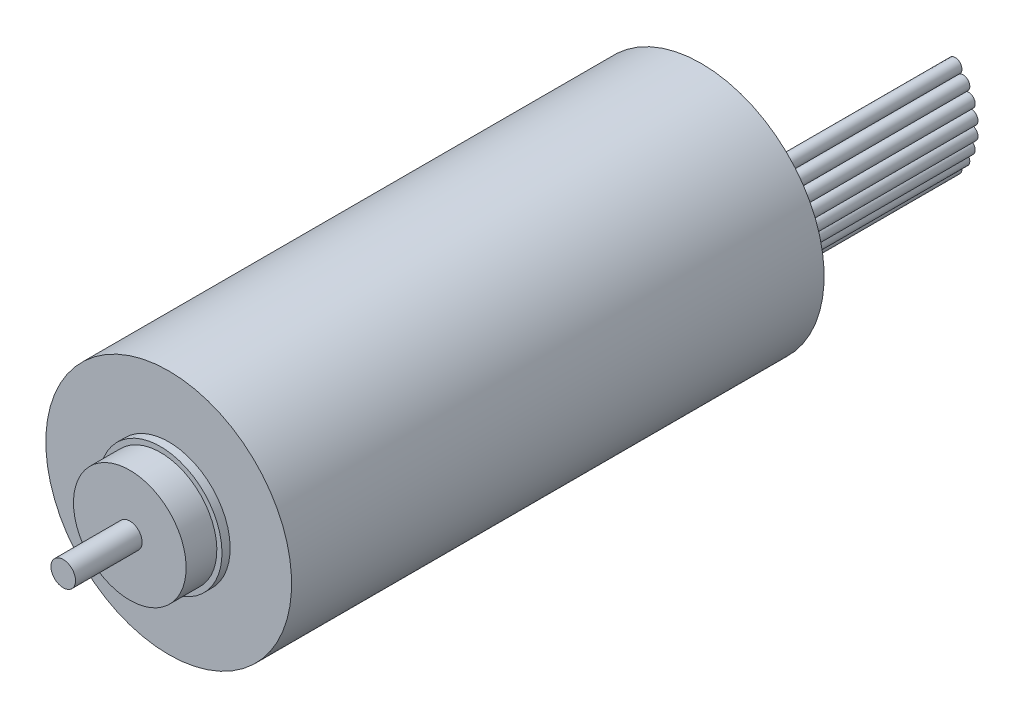
ISO-10303-21;
HEADER;
FILE_DESCRIPTION(('STEP AP214'),'2;1');
FILE_NAME('part.step','',(''),(''),'','','');
FILE_SCHEMA(('AUTOMOTIVE_DESIGN { 1 0 10303 214 1 1 1 1 }'));
ENDSEC;
DATA;
#1=APPLICATION_CONTEXT('core data for automotive mechanical design processes');
#2=APPLICATION_PROTOCOL_DEFINITION('international standard','automotive_design',2000,#1);
#3=PRODUCT_CONTEXT('',#1,'mechanical');
#4=PRODUCT('Part','Part','',(#3));
#5=PRODUCT_RELATED_PRODUCT_CATEGORY('part','',(#4));
#6=PRODUCT_DEFINITION_FORMATION('','',#4);
#7=PRODUCT_DEFINITION_CONTEXT('part definition',#1,'design');
#8=PRODUCT_DEFINITION('design','',#6,#7);
#9=PRODUCT_DEFINITION_SHAPE('','',#8);
#10=(LENGTH_UNIT() NAMED_UNIT(*) SI_UNIT(.MILLI.,.METRE.));
#11=(NAMED_UNIT(*) PLANE_ANGLE_UNIT() SI_UNIT($,.RADIAN.));
#12=(NAMED_UNIT(*) SI_UNIT($,.STERADIAN.) SOLID_ANGLE_UNIT());
#13=UNCERTAINTY_MEASURE_WITH_UNIT(LENGTH_MEASURE(1.E-05),#10,'distance_accuracy_value','');
#14=(GEOMETRIC_REPRESENTATION_CONTEXT(3) GLOBAL_UNCERTAINTY_ASSIGNED_CONTEXT((#13)) GLOBAL_UNIT_ASSIGNED_CONTEXT((#10,
#11,#12)) REPRESENTATION_CONTEXT('',''));
#15=CARTESIAN_POINT('',(0.,0.,0.));
#16=DIRECTION('',(0.,0.,1.));
#17=DIRECTION('',(1.,0.,0.));
#18=AXIS2_PLACEMENT_3D('',#15,#16,#17);
#19=CARTESIAN_POINT('',(3.18293889353849,0.33,-26.));
#20=DIRECTION('',(0.,0.,-1.));
#21=DIRECTION('',(1.,0.,0.));
#22=AXIS2_PLACEMENT_3D('',#19,#20,#21);
#23=CYLINDRICAL_SURFACE('',#22,0.33);
#24=DIRECTION('',(0.,0.,-1.));
#25=VECTOR('',#24,1.);
#26=CARTESIAN_POINT('',(3.11523927527553,0.652981054687497,-26.));
#27=LINE('',#26,#25);
#28=CARTESIAN_POINT('',(3.11523927527553,0.652981054687497,-26.));
#29=VERTEX_POINT('',#28);
#30=CARTESIAN_POINT('',(3.11523927527553,0.652981054687497,-36.));
#31=VERTEX_POINT('',#30);
#32=EDGE_CURVE('E249',#29,#31,#27,.T.);
#33=ORIENTED_EDGE('',*,*,#32,.F.);
#34=CARTESIAN_POINT('',(3.18293889353849,0.33,-26.));
#35=DIRECTION('',(0.,0.,1.));
#36=DIRECTION('',(1.,0.,0.));
#37=AXIS2_PLACEMENT_3D('',#34,#35,#36);
#38=CIRCLE('',#37,0.33);
#39=CARTESIAN_POINT('',(3.18293889353849,0.,-26.));
#40=VERTEX_POINT('',#39);
#41=EDGE_CURVE('E132',#40,#29,#38,.T.);
#42=ORIENTED_EDGE('',*,*,#41,.F.);
#43=DIRECTION('',(0.,0.,-1.));
#44=VECTOR('',#43,1.);
#45=CARTESIAN_POINT('',(3.18293889353849,0.,-26.));
#46=LINE('',#45,#44);
#47=CARTESIAN_POINT('',(3.18293889353849,0.,-36.));
#48=VERTEX_POINT('',#47);
#49=EDGE_CURVE('E10',#40,#48,#46,.T.);
#50=ORIENTED_EDGE('',*,*,#49,.T.);
#51=CARTESIAN_POINT('',(3.18293889353849,0.33,-36.));
#52=DIRECTION('',(0.,0.,1.));
#53=DIRECTION('',(1.,0.,0.));
#54=AXIS2_PLACEMENT_3D('',#51,#52,#53);
#55=CIRCLE('',#54,0.33);
#56=EDGE_CURVE('E26',#48,#31,#55,.T.);
#57=ORIENTED_EDGE('',*,*,#56,.T.);
#58=EDGE_LOOP('',(#33,#42,#50,#57));
#59=FACE_BOUND('',#58,.T.);
#60=ADVANCED_FACE('F16',(#59),#23,.T.);
#61=CARTESIAN_POINT('',(3.18293889353849,0.33,-26.));
#62=DIRECTION('',(0.,0.,-1.));
#63=DIRECTION('',(1.,0.,0.));
#64=AXIS2_PLACEMENT_3D('',#61,#62,#63);
#65=CYLINDRICAL_SURFACE('',#64,0.33);
#66=ORIENTED_EDGE('',*,*,#32,.T.);
#67=CARTESIAN_POINT('',(3.18293889353849,0.33,-36.));
#68=DIRECTION('',(0.,0.,1.));
#69=DIRECTION('',(1.,0.,0.));
#70=AXIS2_PLACEMENT_3D('',#67,#68,#69);
#71=CIRCLE('',#70,0.33);
#72=EDGE_CURVE('E243',#31,#48,#71,.T.);
#73=ORIENTED_EDGE('',*,*,#72,.T.);
#74=ORIENTED_EDGE('',*,*,#49,.F.);
#75=CARTESIAN_POINT('',(3.18293889353849,0.33,-26.));
#76=DIRECTION('',(0.,0.,1.));
#77=DIRECTION('',(1.,0.,0.));
#78=AXIS2_PLACEMENT_3D('',#75,#76,#77);
#79=CIRCLE('',#78,0.33);
#80=EDGE_CURVE('E35',#29,#40,#79,.T.);
#81=ORIENTED_EDGE('',*,*,#80,.F.);
#82=EDGE_LOOP('',(#66,#73,#74,#81));
#83=FACE_BOUND('',#82,.T.);
#84=ADVANCED_FACE('F255',(#83),#65,.T.);
#85=CARTESIAN_POINT('',(3.18293889353849,0.33,-36.));
#86=DIRECTION('',(0.,0.,1.));
#87=DIRECTION('',(0.707106781186548,0.707106781186548,0.));
#88=AXIS2_PLACEMENT_3D('',#85,#86,#87);
#89=PLANE('',#88);
#90=ORIENTED_EDGE('',*,*,#72,.F.);
#91=ORIENTED_EDGE('',*,*,#56,.F.);
#92=EDGE_LOOP('',(#90,#91));
#93=FACE_BOUND('',#92,.T.);
#94=ADVANCED_FACE('F261',(#93),#89,.F.);
#95=CARTESIAN_POINT('',(3.18293889353849,-0.33,-26.));
#96=DIRECTION('',(0.,0.,-1.));
#97=DIRECTION('',(1.,0.,0.));
#98=AXIS2_PLACEMENT_3D('',#95,#96,#97);
#99=CYLINDRICAL_SURFACE('',#98,0.33);
#100=DIRECTION('',(0.,0.,-1.));
#101=VECTOR('',#100,1.);
#102=CARTESIAN_POINT('',(3.18293889353849,0.,-26.));
#103=LINE('',#102,#101);
#104=CARTESIAN_POINT('',(3.18293889353849,0.,-36.));
#105=VERTEX_POINT('',#104);
#106=EDGE_CURVE('E237',#40,#105,#103,.T.);
#107=ORIENTED_EDGE('',*,*,#106,.F.);
#108=CARTESIAN_POINT('',(3.18293889353849,-0.33,-26.));
#109=DIRECTION('',(0.,0.,1.));
#110=DIRECTION('',(1.,0.,0.));
#111=AXIS2_PLACEMENT_3D('',#108,#109,#110);
#112=CIRCLE('',#111,0.33);
#113=CARTESIAN_POINT('',(3.11523927527553,-0.652981054687503,-26.));
#114=VERTEX_POINT('',#113);
#115=EDGE_CURVE('E124',#114,#40,#112,.T.);
#116=ORIENTED_EDGE('',*,*,#115,.F.);
#117=DIRECTION('',(0.,0.,-1.));
#118=VECTOR('',#117,1.);
#119=CARTESIAN_POINT('',(3.11523927527553,-0.652981054687503,-26.));
#120=LINE('',#119,#118);
#121=CARTESIAN_POINT('',(3.11523927527553,-0.652981054687503,-36.));
#122=VERTEX_POINT('',#121);
#123=EDGE_CURVE('E241',#114,#122,#120,.T.);
#124=ORIENTED_EDGE('',*,*,#123,.T.);
#125=CARTESIAN_POINT('',(3.18293889353849,-0.33,-36.));
#126=DIRECTION('',(0.,0.,1.));
#127=DIRECTION('',(1.,0.,0.));
#128=AXIS2_PLACEMENT_3D('',#125,#126,#127);
#129=CIRCLE('',#128,0.33);
#130=EDGE_CURVE('E238',#122,#105,#129,.T.);
#131=ORIENTED_EDGE('',*,*,#130,.T.);
#132=EDGE_LOOP('',(#107,#116,#124,#131));
#133=FACE_BOUND('',#132,.T.);
#134=ADVANCED_FACE('F263',(#133),#99,.T.);
#135=CARTESIAN_POINT('',(3.18293889353849,-0.33,-26.));
#136=DIRECTION('',(0.,0.,-1.));
#137=DIRECTION('',(1.,0.,0.));
#138=AXIS2_PLACEMENT_3D('',#135,#136,#137);
#139=CYLINDRICAL_SURFACE('',#138,0.33);
#140=ORIENTED_EDGE('',*,*,#106,.T.);
#141=CARTESIAN_POINT('',(3.18293889353849,-0.33,-36.));
#142=DIRECTION('',(0.,0.,1.));
#143=DIRECTION('',(1.,0.,0.));
#144=AXIS2_PLACEMENT_3D('',#141,#142,#143);
#145=CIRCLE('',#144,0.33);
#146=EDGE_CURVE('E229',#105,#122,#145,.T.);
#147=ORIENTED_EDGE('',*,*,#146,.T.);
#148=ORIENTED_EDGE('',*,*,#123,.F.);
#149=CARTESIAN_POINT('',(3.18293889353849,-0.33,-26.));
#150=DIRECTION('',(0.,0.,1.));
#151=DIRECTION('',(1.,0.,0.));
#152=AXIS2_PLACEMENT_3D('',#149,#150,#151);
#153=CIRCLE('',#152,0.33);
#154=EDGE_CURVE('E219',#40,#114,#153,.T.);
#155=ORIENTED_EDGE('',*,*,#154,.F.);
#156=EDGE_LOOP('',(#140,#147,#148,#155));
#157=FACE_BOUND('',#156,.T.);
#158=ADVANCED_FACE('F270',(#157),#139,.T.);
#159=CARTESIAN_POINT('',(3.18293889353849,-0.33,-36.));
#160=DIRECTION('',(0.,0.,1.));
#161=DIRECTION('',(0.707106781186548,0.707106781186548,0.));
#162=AXIS2_PLACEMENT_3D('',#159,#160,#161);
#163=PLANE('',#162);
#164=ORIENTED_EDGE('',*,*,#130,.F.);
#165=ORIENTED_EDGE('',*,*,#146,.F.);
#166=EDGE_LOOP('',(#164,#165));
#167=FACE_BOUND('',#166,.T.);
#168=ADVANCED_FACE('F312',(#167),#163,.F.);
#169=CARTESIAN_POINT('',(3.04753965701258,-0.975962109374997,-26.));
#170=DIRECTION('',(0.,0.,-1.));
#171=DIRECTION('',(1.,0.,0.));
#172=AXIS2_PLACEMENT_3D('',#169,#170,#171);
#173=CYLINDRICAL_SURFACE('',#172,0.33);
#174=DIRECTION('',(0.,0.,-1.));
#175=VECTOR('',#174,1.);
#176=CARTESIAN_POINT('',(3.11523927527553,-0.652981054687503,-26.));
#177=LINE('',#176,#175);
#178=CARTESIAN_POINT('',(3.11523927527553,-0.652981054687503,-36.));
#179=VERTEX_POINT('',#178);
#180=EDGE_CURVE('E222',#114,#179,#177,.T.);
#181=ORIENTED_EDGE('',*,*,#180,.F.);
#182=CARTESIAN_POINT('',(3.04753965701258,-0.975962109374997,-26.));
#183=DIRECTION('',(0.,0.,1.));
#184=DIRECTION('',(1.,0.,0.));
#185=AXIS2_PLACEMENT_3D('',#182,#183,#184);
#186=CIRCLE('',#185,0.33);
#187=CARTESIAN_POINT('',(2.91502029877917,-1.27818490747833,-26.));
#188=VERTEX_POINT('',#187);
#189=EDGE_CURVE('E125',#188,#114,#186,.T.);
#190=ORIENTED_EDGE('',*,*,#189,.F.);
#191=DIRECTION('',(0.,0.,-1.));
#192=VECTOR('',#191,1.);
#193=CARTESIAN_POINT('',(2.91502029877917,-1.27818490747833,-26.));
#194=LINE('',#193,#192);
#195=CARTESIAN_POINT('',(2.91502029877917,-1.27818490747833,-36.));
#196=VERTEX_POINT('',#195);
#197=EDGE_CURVE('E226',#188,#196,#194,.T.);
#198=ORIENTED_EDGE('',*,*,#197,.T.);
#199=CARTESIAN_POINT('',(3.04753965701258,-0.975962109374997,-36.));
#200=DIRECTION('',(0.,0.,1.));
#201=DIRECTION('',(1.,0.,0.));
#202=AXIS2_PLACEMENT_3D('',#199,#200,#201);
#203=CIRCLE('',#202,0.33);
#204=EDGE_CURVE('E223',#196,#179,#203,.T.);
#205=ORIENTED_EDGE('',*,*,#204,.T.);
#206=EDGE_LOOP('',(#181,#190,#198,#205));
#207=FACE_BOUND('',#206,.T.);
#208=ADVANCED_FACE('F323',(#207),#173,.T.);
#209=CARTESIAN_POINT('',(3.04753965701258,-0.975962109374997,-26.));
#210=DIRECTION('',(0.,0.,-1.));
#211=DIRECTION('',(1.,0.,0.));
#212=AXIS2_PLACEMENT_3D('',#209,#210,#211);
#213=CYLINDRICAL_SURFACE('',#212,0.33);
#214=ORIENTED_EDGE('',*,*,#180,.T.);
#215=CARTESIAN_POINT('',(3.04753965701258,-0.975962109374997,-36.));
#216=DIRECTION('',(0.,0.,1.));
#217=DIRECTION('',(1.,0.,0.));
#218=AXIS2_PLACEMENT_3D('',#215,#216,#217);
#219=CIRCLE('',#218,0.33);
#220=EDGE_CURVE('E213',#179,#196,#219,.T.);
#221=ORIENTED_EDGE('',*,*,#220,.T.);
#222=ORIENTED_EDGE('',*,*,#197,.F.);
#223=CARTESIAN_POINT('',(3.04753965701258,-0.975962109374997,-26.));
#224=DIRECTION('',(0.,0.,1.));
#225=DIRECTION('',(1.,0.,0.));
#226=AXIS2_PLACEMENT_3D('',#223,#224,#225);
#227=CIRCLE('',#226,0.33);
#228=EDGE_CURVE('E203',#114,#188,#227,.T.);
#229=ORIENTED_EDGE('',*,*,#228,.F.);
#230=EDGE_LOOP('',(#214,#221,#222,#229));
#231=FACE_BOUND('',#230,.T.);
#232=ADVANCED_FACE('F334',(#231),#213,.T.);
#233=CARTESIAN_POINT('',(3.04753965701258,-0.975962109374997,-36.));
#234=DIRECTION('',(0.,0.,1.));
#235=DIRECTION('',(0.707106781186548,0.707106781186548,0.));
#236=AXIS2_PLACEMENT_3D('',#233,#234,#235);
#237=PLANE('',#236);
#238=ORIENTED_EDGE('',*,*,#204,.F.);
#239=ORIENTED_EDGE('',*,*,#220,.F.);
#240=EDGE_LOOP('',(#238,#239));
#241=FACE_BOUND('',#240,.T.);
#242=ADVANCED_FACE('F345',(#241),#237,.F.);
#243=CARTESIAN_POINT('',(2.78250094054577,-1.58040770558166,-26.));
#244=DIRECTION('',(0.,0.,-1.));
#245=DIRECTION('',(1.,0.,0.));
#246=AXIS2_PLACEMENT_3D('',#243,#244,#245);
#247=CYLINDRICAL_SURFACE('',#246,0.33);
#248=DIRECTION('',(0.,0.,-1.));
#249=VECTOR('',#248,1.);
#250=CARTESIAN_POINT('',(2.91502029877917,-1.27818490747833,-26.));
#251=LINE('',#250,#249);
#252=CARTESIAN_POINT('',(2.91502029877917,-1.27818490747833,-36.));
#253=VERTEX_POINT('',#252);
#254=EDGE_CURVE('E206',#188,#253,#251,.T.);
#255=ORIENTED_EDGE('',*,*,#254,.F.);
#256=CARTESIAN_POINT('',(2.78250094054577,-1.58040770558166,-26.));
#257=DIRECTION('',(0.,0.,1.));
#258=DIRECTION('',(1.,0.,0.));
#259=AXIS2_PLACEMENT_3D('',#256,#257,#258);
#260=CIRCLE('',#259,0.33);
#261=CARTESIAN_POINT('',(2.59079909160428,-1.84901597260339,-26.));
#262=VERTEX_POINT('',#261);
#263=EDGE_CURVE('E200',#262,#188,#260,.T.);
#264=ORIENTED_EDGE('',*,*,#263,.F.);
#265=DIRECTION('',(0.,0.,-1.));
#266=VECTOR('',#265,1.);
#267=CARTESIAN_POINT('',(2.59079909160428,-1.84901597260339,-26.));
#268=LINE('',#267,#266);
#269=CARTESIAN_POINT('',(2.59079909160428,-1.84901597260339,-36.));
#270=VERTEX_POINT('',#269);
#271=EDGE_CURVE('E210',#262,#270,#268,.T.);
#272=ORIENTED_EDGE('',*,*,#271,.T.);
#273=CARTESIAN_POINT('',(2.78250094054577,-1.58040770558166,-36.));
#274=DIRECTION('',(0.,0.,1.));
#275=DIRECTION('',(1.,0.,0.));
#276=AXIS2_PLACEMENT_3D('',#273,#274,#275);
#277=CIRCLE('',#276,0.33);
#278=EDGE_CURVE('E207',#270,#253,#277,.T.);
#279=ORIENTED_EDGE('',*,*,#278,.T.);
#280=EDGE_LOOP('',(#255,#264,#272,#279));
#281=FACE_BOUND('',#280,.T.);
#282=ADVANCED_FACE('F356',(#281),#247,.T.);
#283=CARTESIAN_POINT('',(2.78250094054577,-1.58040770558166,-26.));
#284=DIRECTION('',(0.,0.,-1.));
#285=DIRECTION('',(1.,0.,0.));
#286=AXIS2_PLACEMENT_3D('',#283,#284,#285);
#287=CYLINDRICAL_SURFACE('',#286,0.33);
#288=ORIENTED_EDGE('',*,*,#254,.T.);
#289=CARTESIAN_POINT('',(2.78250094054577,-1.58040770558166,-36.));
#290=DIRECTION('',(0.,0.,1.));
#291=DIRECTION('',(1.,0.,0.));
#292=AXIS2_PLACEMENT_3D('',#289,#290,#291);
#293=CIRCLE('',#292,0.33);
#294=EDGE_CURVE('E195',#253,#270,#293,.T.);
#295=ORIENTED_EDGE('',*,*,#294,.T.);
#296=ORIENTED_EDGE('',*,*,#271,.F.);
#297=CARTESIAN_POINT('',(2.78250094054577,-1.58040770558166,-26.));
#298=DIRECTION('',(0.,0.,1.));
#299=DIRECTION('',(1.,0.,0.));
#300=AXIS2_PLACEMENT_3D('',#297,#298,#299);
#301=CIRCLE('',#300,0.33);
#302=EDGE_CURVE('E199',#188,#262,#301,.T.);
#303=ORIENTED_EDGE('',*,*,#302,.F.);
#304=EDGE_LOOP('',(#288,#295,#296,#303));
#305=FACE_BOUND('',#304,.T.);
#306=ADVANCED_FACE('F367',(#305),#287,.T.);
#307=CARTESIAN_POINT('',(2.78250094054577,-1.58040770558166,-36.));
#308=DIRECTION('',(0.,0.,1.));
#309=DIRECTION('',(0.707106781186548,0.707106781186548,0.));
#310=AXIS2_PLACEMENT_3D('',#307,#308,#309);
#311=PLANE('',#310);
#312=ORIENTED_EDGE('',*,*,#278,.F.);
#313=ORIENTED_EDGE('',*,*,#294,.F.);
#314=EDGE_LOOP('',(#312,#313));
#315=FACE_BOUND('',#314,.T.);
#316=ADVANCED_FACE('F378',(#315),#311,.F.);
#317=CARTESIAN_POINT('',(2.39909724266278,-2.11762423962512,-26.));
#318=DIRECTION('',(0.,0.,-1.));
#319=DIRECTION('',(1.,0.,0.));
#320=AXIS2_PLACEMENT_3D('',#317,#318,#319);
#321=CYLINDRICAL_SURFACE('',#320,0.33);
#322=CARTESIAN_POINT('',(2.39909724266278,-2.11762423962512,-26.));
#323=DIRECTION('',(0.,0.,1.));
#324=DIRECTION('',(1.,0.,0.));
#325=AXIS2_PLACEMENT_3D('',#322,#323,#324);
#326=CIRCLE('',#325,0.33);
#327=EDGE_CURVE('E196',#262,#262,#326,.T.);
#328=ORIENTED_EDGE('',*,*,#327,.F.);
#329=DIRECTION('',(0.,0.,-1.));
#330=VECTOR('',#329,1.);
#331=CARTESIAN_POINT('',(2.59079909160428,-1.84901597260339,-26.));
#332=LINE('',#331,#330);
#333=CARTESIAN_POINT('',(2.59079909160428,-1.84901597260339,-36.));
#334=VERTEX_POINT('',#333);
#335=EDGE_CURVE('E192',#262,#334,#332,.T.);
#336=ORIENTED_EDGE('',*,*,#335,.T.);
#337=CARTESIAN_POINT('',(2.39909724266278,-2.11762423962512,-36.));
#338=DIRECTION('',(0.,0.,1.));
#339=DIRECTION('',(1.,0.,0.));
#340=AXIS2_PLACEMENT_3D('',#337,#338,#339);
#341=CIRCLE('',#340,0.33);
#342=EDGE_CURVE('E187',#334,#334,#341,.T.);
#343=ORIENTED_EDGE('',*,*,#342,.T.);
#344=ORIENTED_EDGE('',*,*,#335,.F.);
#345=EDGE_LOOP('',(#328,#336,#343,#344));
#346=FACE_BOUND('',#345,.T.);
#347=ADVANCED_FACE('F389',(#346),#321,.T.);
#348=CARTESIAN_POINT('',(2.39909724266278,-2.11762423962512,-36.));
#349=DIRECTION('',(0.,0.,1.));
#350=DIRECTION('',(0.707106781186548,0.707106781186548,0.));
#351=AXIS2_PLACEMENT_3D('',#348,#349,#350);
#352=PLANE('',#351);
#353=ORIENTED_EDGE('',*,*,#342,.F.);
#354=EDGE_LOOP('',(#353));
#355=FACE_BOUND('',#354,.T.);
#356=ADVANCED_FACE('F400',(#355),#352,.F.);
#357=CARTESIAN_POINT('',(3.04753965701258,0.975962109374998,-26.));
#358=DIRECTION('',(0.,0.,-1.));
#359=DIRECTION('',(1.,0.,0.));
#360=AXIS2_PLACEMENT_3D('',#357,#358,#359);
#361=CYLINDRICAL_SURFACE('',#360,0.33);
#362=DIRECTION('',(0.,0.,-1.));
#363=VECTOR('',#362,1.);
#364=CARTESIAN_POINT('',(3.11523927527553,0.652981054687497,-26.));
#365=LINE('',#364,#363);
#366=CARTESIAN_POINT('',(3.11523927527553,0.652981054687497,-36.));
#367=VERTEX_POINT('',#366);
#368=EDGE_CURVE('E180',#29,#367,#365,.T.);
#369=ORIENTED_EDGE('',*,*,#368,.F.);
#370=CARTESIAN_POINT('',(3.04753965701258,0.975962109374998,-26.));
#371=DIRECTION('',(0.,0.,1.));
#372=DIRECTION('',(1.,0.,0.));
#373=AXIS2_PLACEMENT_3D('',#370,#371,#372);
#374=CIRCLE('',#373,0.33);
#375=CARTESIAN_POINT('',(2.91502029877917,1.27818490747833,-26.));
#376=VERTEX_POINT('',#375);
#377=EDGE_CURVE('E174',#376,#29,#374,.T.);
#378=ORIENTED_EDGE('',*,*,#377,.F.);
#379=DIRECTION('',(0.,0.,-1.));
#380=VECTOR('',#379,1.);
#381=CARTESIAN_POINT('',(2.91502029877917,1.27818490747833,-26.));
#382=LINE('',#381,#380);
#383=CARTESIAN_POINT('',(2.91502029877917,1.27818490747833,-36.));
#384=VERTEX_POINT('',#383);
#385=EDGE_CURVE('E184',#376,#384,#382,.T.);
#386=ORIENTED_EDGE('',*,*,#385,.T.);
#387=CARTESIAN_POINT('',(3.04753965701258,0.975962109374998,-36.));
#388=DIRECTION('',(0.,0.,1.));
#389=DIRECTION('',(1.,0.,0.));
#390=AXIS2_PLACEMENT_3D('',#387,#388,#389);
#391=CIRCLE('',#390,0.33);
#392=EDGE_CURVE('E181',#384,#367,#391,.T.);
#393=ORIENTED_EDGE('',*,*,#392,.T.);
#394=EDGE_LOOP('',(#369,#378,#386,#393));
#395=FACE_BOUND('',#394,.T.);
#396=ADVANCED_FACE('F411',(#395),#361,.T.);
#397=CARTESIAN_POINT('',(3.04753965701258,0.975962109374998,-26.));
#398=DIRECTION('',(0.,0.,-1.));
#399=DIRECTION('',(1.,0.,0.));
#400=AXIS2_PLACEMENT_3D('',#397,#398,#399);
#401=CYLINDRICAL_SURFACE('',#400,0.33);
#402=ORIENTED_EDGE('',*,*,#368,.T.);
#403=CARTESIAN_POINT('',(3.04753965701258,0.975962109374998,-36.));
#404=DIRECTION('',(0.,0.,1.));
#405=DIRECTION('',(1.,0.,0.));
#406=AXIS2_PLACEMENT_3D('',#403,#404,#405);
#407=CIRCLE('',#406,0.33);
#408=EDGE_CURVE('E171',#367,#384,#407,.T.);
#409=ORIENTED_EDGE('',*,*,#408,.T.);
#410=ORIENTED_EDGE('',*,*,#385,.F.);
#411=CARTESIAN_POINT('',(3.04753965701258,0.975962109374998,-26.));
#412=DIRECTION('',(0.,0.,1.));
#413=DIRECTION('',(1.,0.,0.));
#414=AXIS2_PLACEMENT_3D('',#411,#412,#413);
#415=CIRCLE('',#414,0.33);
#416=EDGE_CURVE('E161',#29,#376,#415,.T.);
#417=ORIENTED_EDGE('',*,*,#416,.F.);
#418=EDGE_LOOP('',(#402,#409,#410,#417));
#419=FACE_BOUND('',#418,.T.);
#420=ADVANCED_FACE('F422',(#419),#401,.T.);
#421=CARTESIAN_POINT('',(3.04753965701258,0.975962109374998,-36.));
#422=DIRECTION('',(0.,0.,1.));
#423=DIRECTION('',(0.707106781186548,0.707106781186548,0.));
#424=AXIS2_PLACEMENT_3D('',#421,#422,#423);
#425=PLANE('',#424);
#426=ORIENTED_EDGE('',*,*,#392,.F.);
#427=ORIENTED_EDGE('',*,*,#408,.F.);
#428=EDGE_LOOP('',(#426,#427));
#429=FACE_BOUND('',#428,.T.);
#430=ADVANCED_FACE('F433',(#429),#425,.F.);
#431=CARTESIAN_POINT('',(2.78250094054577,1.58040770558166,-26.));
#432=DIRECTION('',(0.,0.,-1.));
#433=DIRECTION('',(1.,0.,0.));
#434=AXIS2_PLACEMENT_3D('',#431,#432,#433);
#435=CYLINDRICAL_SURFACE('',#434,0.33);
#436=DIRECTION('',(0.,0.,-1.));
#437=VECTOR('',#436,1.);
#438=CARTESIAN_POINT('',(2.91502029877917,1.27818490747833,-26.));
#439=LINE('',#438,#437);
#440=CARTESIAN_POINT('',(2.91502029877917,1.27818490747833,-36.));
#441=VERTEX_POINT('',#440);
#442=EDGE_CURVE('E164',#376,#441,#439,.T.);
#443=ORIENTED_EDGE('',*,*,#442,.F.);
#444=CARTESIAN_POINT('',(2.78250094054577,1.58040770558166,-26.));
#445=DIRECTION('',(0.,0.,1.));
#446=DIRECTION('',(1.,0.,0.));
#447=AXIS2_PLACEMENT_3D('',#444,#445,#446);
#448=CIRCLE('',#447,0.33);
#449=CARTESIAN_POINT('',(2.59079909160428,1.84901597260339,-26.));
#450=VERTEX_POINT('',#449);
#451=EDGE_CURVE('E158',#450,#376,#448,.T.);
#452=ORIENTED_EDGE('',*,*,#451,.F.);
#453=DIRECTION('',(0.,0.,-1.));
#454=VECTOR('',#453,1.);
#455=CARTESIAN_POINT('',(2.59079909160428,1.84901597260339,-26.));
#456=LINE('',#455,#454);
#457=CARTESIAN_POINT('',(2.59079909160428,1.84901597260339,-36.));
#458=VERTEX_POINT('',#457);
#459=EDGE_CURVE('E168',#450,#458,#456,.T.);
#460=ORIENTED_EDGE('',*,*,#459,.T.);
#461=CARTESIAN_POINT('',(2.78250094054577,1.58040770558166,-36.));
#462=DIRECTION('',(0.,0.,1.));
#463=DIRECTION('',(1.,0.,0.));
#464=AXIS2_PLACEMENT_3D('',#461,#462,#463);
#465=CIRCLE('',#464,0.33);
#466=EDGE_CURVE('E165',#458,#441,#465,.T.);
#467=ORIENTED_EDGE('',*,*,#466,.T.);
#468=EDGE_LOOP('',(#443,#452,#460,#467));
#469=FACE_BOUND('',#468,.T.);
#470=ADVANCED_FACE('F444',(#469),#435,.T.);
#471=CARTESIAN_POINT('',(2.78250094054577,1.58040770558166,-26.));
#472=DIRECTION('',(0.,0.,-1.));
#473=DIRECTION('',(1.,0.,0.));
#474=AXIS2_PLACEMENT_3D('',#471,#472,#473);
#475=CYLINDRICAL_SURFACE('',#474,0.33);
#476=ORIENTED_EDGE('',*,*,#442,.T.);
#477=CARTESIAN_POINT('',(2.78250094054577,1.58040770558166,-36.));
#478=DIRECTION('',(0.,0.,1.));
#479=DIRECTION('',(1.,0.,0.));
#480=AXIS2_PLACEMENT_3D('',#477,#478,#479);
#481=CIRCLE('',#480,0.33);
#482=EDGE_CURVE('E153',#441,#458,#481,.T.);
#483=ORIENTED_EDGE('',*,*,#482,.T.);
#484=ORIENTED_EDGE('',*,*,#459,.F.);
#485=CARTESIAN_POINT('',(2.78250094054577,1.58040770558166,-26.));
#486=DIRECTION('',(0.,0.,1.));
#487=DIRECTION('',(1.,0.,0.));
#488=AXIS2_PLACEMENT_3D('',#485,#486,#487);
#489=CIRCLE('',#488,0.33);
#490=EDGE_CURVE('E157',#376,#450,#489,.T.);
#491=ORIENTED_EDGE('',*,*,#490,.F.);
#492=EDGE_LOOP('',(#476,#483,#484,#491));
#493=FACE_BOUND('',#492,.T.);
#494=ADVANCED_FACE('F455',(#493),#475,.T.);
#495=CARTESIAN_POINT('',(2.78250094054577,1.58040770558166,-36.));
#496=DIRECTION('',(0.,0.,1.));
#497=DIRECTION('',(0.707106781186548,0.707106781186548,0.));
#498=AXIS2_PLACEMENT_3D('',#495,#496,#497);
#499=PLANE('',#498);
#500=ORIENTED_EDGE('',*,*,#466,.F.);
#501=ORIENTED_EDGE('',*,*,#482,.F.);
#502=EDGE_LOOP('',(#500,#501));
#503=FACE_BOUND('',#502,.T.);
#504=ADVANCED_FACE('F466',(#503),#499,.F.);
#505=CARTESIAN_POINT('',(2.39909724266279,2.11762423962511,-26.));
#506=DIRECTION('',(0.,0.,-1.));
#507=DIRECTION('',(1.,0.,0.));
#508=AXIS2_PLACEMENT_3D('',#505,#506,#507);
#509=CYLINDRICAL_SURFACE('',#508,0.33);
#510=CARTESIAN_POINT('',(2.39909724266279,2.11762423962511,-26.));
#511=DIRECTION('',(0.,0.,1.));
#512=DIRECTION('',(1.,0.,0.));
#513=AXIS2_PLACEMENT_3D('',#510,#511,#512);
#514=CIRCLE('',#513,0.33);
#515=EDGE_CURVE('E154',#450,#450,#514,.T.);
#516=ORIENTED_EDGE('',*,*,#515,.F.);
#517=DIRECTION('',(0.,0.,-1.));
#518=VECTOR('',#517,1.);
#519=CARTESIAN_POINT('',(2.59079909160428,1.84901597260339,-26.));
#520=LINE('',#519,#518);
#521=CARTESIAN_POINT('',(2.59079909160428,1.84901597260339,-36.));
#522=VERTEX_POINT('',#521);
#523=EDGE_CURVE('E150',#450,#522,#520,.T.);
#524=ORIENTED_EDGE('',*,*,#523,.T.);
#525=CARTESIAN_POINT('',(2.39909724266279,2.11762423962511,-36.));
#526=DIRECTION('',(0.,0.,1.));
#527=DIRECTION('',(1.,0.,0.));
#528=AXIS2_PLACEMENT_3D('',#525,#526,#527);
#529=CIRCLE('',#528,0.33);
#530=EDGE_CURVE('E145',#522,#522,#529,.T.);
#531=ORIENTED_EDGE('',*,*,#530,.T.);
#532=ORIENTED_EDGE('',*,*,#523,.F.);
#533=EDGE_LOOP('',(#516,#524,#531,#532));
#534=FACE_BOUND('',#533,.T.);
#535=ADVANCED_FACE('F477',(#534),#509,.T.);
#536=CARTESIAN_POINT('',(2.39909724266279,2.11762423962511,-36.));
#537=DIRECTION('',(0.,0.,1.));
#538=DIRECTION('',(0.707106781186548,0.707106781186548,0.));
#539=AXIS2_PLACEMENT_3D('',#536,#537,#538);
#540=PLANE('',#539);
#541=ORIENTED_EDGE('',*,*,#530,.F.);
#542=EDGE_LOOP('',(#541));
#543=FACE_BOUND('',#542,.T.);
#544=ADVANCED_FACE('F488',(#543),#540,.F.);
#545=CARTESIAN_POINT('',(0.,0.,0.2));
#546=DIRECTION('',(0.,0.,1.));
#547=DIRECTION('',(0.,-1.,0.));
#548=AXIS2_PLACEMENT_3D('',#545,#546,#547);
#549=CYLINDRICAL_SURFACE('',#548,3.);
#550=CARTESIAN_POINT('',(0.,0.,0.4));
#551=DIRECTION('',(0.,0.,1.));
#552=DIRECTION('',(0.,-1.,0.));
#553=AXIS2_PLACEMENT_3D('',#550,#551,#552);
#554=CIRCLE('',#553,3.);
#555=CARTESIAN_POINT('',(0.,-3.,0.4));
#556=VERTEX_POINT('',#555);
#557=EDGE_CURVE('E141',#556,#556,#554,.T.);
#558=ORIENTED_EDGE('',*,*,#557,.F.);
#559=EDGE_LOOP('',(#558));
#560=FACE_BOUND('',#559,.T.);
#561=CARTESIAN_POINT('',(0.,0.,0.));
#562=DIRECTION('',(0.,0.,1.));
#563=DIRECTION('',(0.,-1.,0.));
#564=AXIS2_PLACEMENT_3D('',#561,#562,#563);
#565=CIRCLE('',#564,3.);
#566=CARTESIAN_POINT('',(0.,-3.,0.));
#567=VERTEX_POINT('',#566);
#568=EDGE_CURVE('E142',#567,#567,#565,.T.);
#569=ORIENTED_EDGE('',*,*,#568,.T.);
#570=EDGE_LOOP('',(#569));
#571=FACE_BOUND('',#570,.T.);
#572=ADVANCED_FACE('F499',(#560,#571),#549,.T.);
#573=CARTESIAN_POINT('',(0.,-2.875,0.4));
#574=DIRECTION('',(0.,0.,1.));
#575=DIRECTION('',(0.707106781186548,0.707106781186548,0.));
#576=AXIS2_PLACEMENT_3D('',#573,#574,#575);
#577=PLANE('',#576);
#578=CARTESIAN_POINT('',(0.,0.,0.4));
#579=DIRECTION('',(0.,0.,1.));
#580=DIRECTION('',(0.,-1.,0.));
#581=AXIS2_PLACEMENT_3D('',#578,#579,#580);
#582=CIRCLE('',#581,2.75);
#583=CARTESIAN_POINT('',(0.,-2.75,0.4));
#584=VERTEX_POINT('',#583);
#585=EDGE_CURVE('E138',#584,#584,#582,.T.);
#586=ORIENTED_EDGE('',*,*,#585,.F.);
#587=EDGE_LOOP('',(#586));
#588=FACE_BOUND('',#587,.T.);
#589=ORIENTED_EDGE('',*,*,#557,.T.);
#590=EDGE_LOOP('',(#589));
#591=FACE_BOUND('',#590,.T.);
#592=ADVANCED_FACE('F511',(#588,#591),#577,.T.);
#593=CARTESIAN_POINT('',(0.,0.,1.15));
#594=DIRECTION('',(0.,0.,1.));
#595=DIRECTION('',(0.,-1.,0.));
#596=AXIS2_PLACEMENT_3D('',#593,#594,#595);
#597=CYLINDRICAL_SURFACE('',#596,2.75);
#598=CARTESIAN_POINT('',(0.,0.,1.9));
#599=DIRECTION('',(0.,0.,1.));
#600=DIRECTION('',(0.,-1.,0.));
#601=AXIS2_PLACEMENT_3D('',#598,#599,#600);
#602=CIRCLE('',#601,2.75);
#603=CARTESIAN_POINT('',(0.,-2.75,1.9));
#604=VERTEX_POINT('',#603);
#605=EDGE_CURVE('E135',#604,#604,#602,.T.);
#606=ORIENTED_EDGE('',*,*,#605,.F.);
#607=EDGE_LOOP('',(#606));
#608=FACE_BOUND('',#607,.T.);
#609=ORIENTED_EDGE('',*,*,#585,.T.);
#610=EDGE_LOOP('',(#609));
#611=FACE_BOUND('',#610,.T.);
#612=ADVANCED_FACE('F525',(#608,#611),#597,.T.);
#613=CARTESIAN_POINT('',(0.,-1.675,1.9));
#614=DIRECTION('',(0.,0.,1.));
#615=DIRECTION('',(0.707106781186548,0.707106781186548,0.));
#616=AXIS2_PLACEMENT_3D('',#613,#614,#615);
#617=PLANE('',#616);
#618=CARTESIAN_POINT('',(0.,0.,1.9));
#619=DIRECTION('',(0.,0.,1.));
#620=DIRECTION('',(0.,-1.,0.));
#621=AXIS2_PLACEMENT_3D('',#618,#619,#620);
#622=CIRCLE('',#621,0.6);
#623=CARTESIAN_POINT('',(0.,-0.6,1.9));
#624=VERTEX_POINT('',#623);
#625=EDGE_CURVE('E131',#624,#624,#622,.T.);
#626=ORIENTED_EDGE('',*,*,#625,.F.);
#627=EDGE_LOOP('',(#626));
#628=FACE_BOUND('',#627,.T.);
#629=ORIENTED_EDGE('',*,*,#605,.T.);
#630=EDGE_LOOP('',(#629));
#631=FACE_BOUND('',#630,.T.);
#632=ADVANCED_FACE('F537',(#628,#631),#617,.T.);
#633=CARTESIAN_POINT('',(0.,0.,3.525));
#634=DIRECTION('',(0.,0.,1.));
#635=DIRECTION('',(0.,-1.,0.));
#636=AXIS2_PLACEMENT_3D('',#633,#634,#635);
#637=CYLINDRICAL_SURFACE('',#636,0.6);
#638=CARTESIAN_POINT('',(0.,0.,5.15));
#639=DIRECTION('',(0.,0.,1.));
#640=DIRECTION('',(0.,-1.,0.));
#641=AXIS2_PLACEMENT_3D('',#638,#639,#640);
#642=CIRCLE('',#641,0.6);
#643=CARTESIAN_POINT('',(0.,-0.6,5.15));
#644=VERTEX_POINT('',#643);
#645=EDGE_CURVE('E128',#644,#644,#642,.T.);
#646=ORIENTED_EDGE('',*,*,#645,.F.);
#647=EDGE_LOOP('',(#646));
#648=FACE_BOUND('',#647,.T.);
#649=ORIENTED_EDGE('',*,*,#625,.T.);
#650=EDGE_LOOP('',(#649));
#651=FACE_BOUND('',#650,.T.);
#652=ADVANCED_FACE('F549',(#648,#651),#637,.T.);
#653=CARTESIAN_POINT('',(0.,-0.3,5.15));
#654=DIRECTION('',(0.,0.,1.));
#655=DIRECTION('',(0.707106781186548,0.707106781186548,0.));
#656=AXIS2_PLACEMENT_3D('',#653,#654,#655);
#657=PLANE('',#656);
#658=ORIENTED_EDGE('',*,*,#645,.T.);
#659=EDGE_LOOP('',(#658));
#660=FACE_BOUND('',#659,.T.);
#661=ADVANCED_FACE('F561',(#660),#657,.T.);
#662=CARTESIAN_POINT('',(0.,-3.,-26.));
#663=DIRECTION('',(0.,0.,-1.));
#664=DIRECTION('',(0.707106781186548,0.707106781186548,0.));
#665=AXIS2_PLACEMENT_3D('',#662,#663,#664);
#666=PLANE('',#665);
#667=ORIENTED_EDGE('',*,*,#41,.T.);
#668=ORIENTED_EDGE('',*,*,#416,.T.);
#669=ORIENTED_EDGE('',*,*,#490,.T.);
#670=ORIENTED_EDGE('',*,*,#515,.T.);
#671=ORIENTED_EDGE('',*,*,#451,.T.);
#672=ORIENTED_EDGE('',*,*,#377,.T.);
#673=ORIENTED_EDGE('',*,*,#80,.T.);
#674=ORIENTED_EDGE('',*,*,#154,.T.);
#675=ORIENTED_EDGE('',*,*,#228,.T.);
#676=ORIENTED_EDGE('',*,*,#302,.T.);
#677=ORIENTED_EDGE('',*,*,#327,.T.);
#678=ORIENTED_EDGE('',*,*,#263,.T.);
#679=ORIENTED_EDGE('',*,*,#189,.T.);
#680=ORIENTED_EDGE('',*,*,#115,.T.);
#681=EDGE_LOOP('',(#667,#668,#669,#670,#671,#672,#673,#674,#675,#676,#677,#678,#679,#680));
#682=FACE_BOUND('',#681,.T.);
#683=CARTESIAN_POINT('',(0.,0.,-26.));
#684=DIRECTION('',(0.,0.,1.));
#685=DIRECTION('',(0.,-1.,0.));
#686=AXIS2_PLACEMENT_3D('',#683,#684,#685);
#687=CIRCLE('',#686,6.);
#688=CARTESIAN_POINT('',(0.,-6.,-26.));
#689=VERTEX_POINT('',#688);
#690=EDGE_CURVE('E117',#689,#689,#687,.T.);
#691=ORIENTED_EDGE('',*,*,#690,.F.);
#692=EDGE_LOOP('',(#691));
#693=FACE_BOUND('',#692,.T.);
#694=ADVANCED_FACE('F572',(#682,#693),#666,.T.);
#695=CARTESIAN_POINT('',(0.,0.,-13.));
#696=DIRECTION('',(0.,0.,1.));
#697=DIRECTION('',(0.,-1.,0.));
#698=AXIS2_PLACEMENT_3D('',#695,#696,#697);
#699=CYLINDRICAL_SURFACE('',#698,6.);
#700=CARTESIAN_POINT('',(0.,0.,0.));
#701=DIRECTION('',(0.,0.,1.));
#702=DIRECTION('',(0.,-1.,0.));
#703=AXIS2_PLACEMENT_3D('',#700,#701,#702);
#704=CIRCLE('',#703,6.);
#705=CARTESIAN_POINT('',(0.,-6.,0.));
#706=VERTEX_POINT('',#705);
#707=EDGE_CURVE('E20',#706,#706,#704,.T.);
#708=ORIENTED_EDGE('',*,*,#707,.F.);
#709=EDGE_LOOP('',(#708));
#710=FACE_BOUND('',#709,.T.);
#711=ORIENTED_EDGE('',*,*,#690,.T.);
#712=EDGE_LOOP('',(#711));
#713=FACE_BOUND('',#712,.T.);
#714=ADVANCED_FACE('F121',(#710,#713),#699,.T.);
#715=CARTESIAN_POINT('',(0.,-4.5,0.));
#716=DIRECTION('',(0.,0.,1.));
#717=DIRECTION('',(0.707106781186548,0.707106781186548,0.));
#718=AXIS2_PLACEMENT_3D('',#715,#716,#717);
#719=PLANE('',#718);
#720=ORIENTED_EDGE('',*,*,#568,.F.);
#721=EDGE_LOOP('',(#720));
#722=FACE_BOUND('',#721,.T.);
#723=ORIENTED_EDGE('',*,*,#707,.T.);
#724=EDGE_LOOP('',(#723));
#725=FACE_BOUND('',#724,.T.);
#726=ADVANCED_FACE('F18',(#722,#725),#719,.T.);
#727=CLOSED_SHELL('',(#60,#84,#94,#134,#158,#168,#208,#232,#242,#282,#306,#316,#347,#356,#396,
#420,#430,#470,#494,#504,#535,#544,#572,#592,#612,#632,#652,#661,#694,#714,#726));
#728=MANIFOLD_SOLID_BREP('B1',#727);
#729=ADVANCED_BREP_SHAPE_REPRESENTATION('',(#18,#728),#14);
#730=SHAPE_DEFINITION_REPRESENTATION(#9,#729);
ENDSEC;
END-ISO-10303-21;
